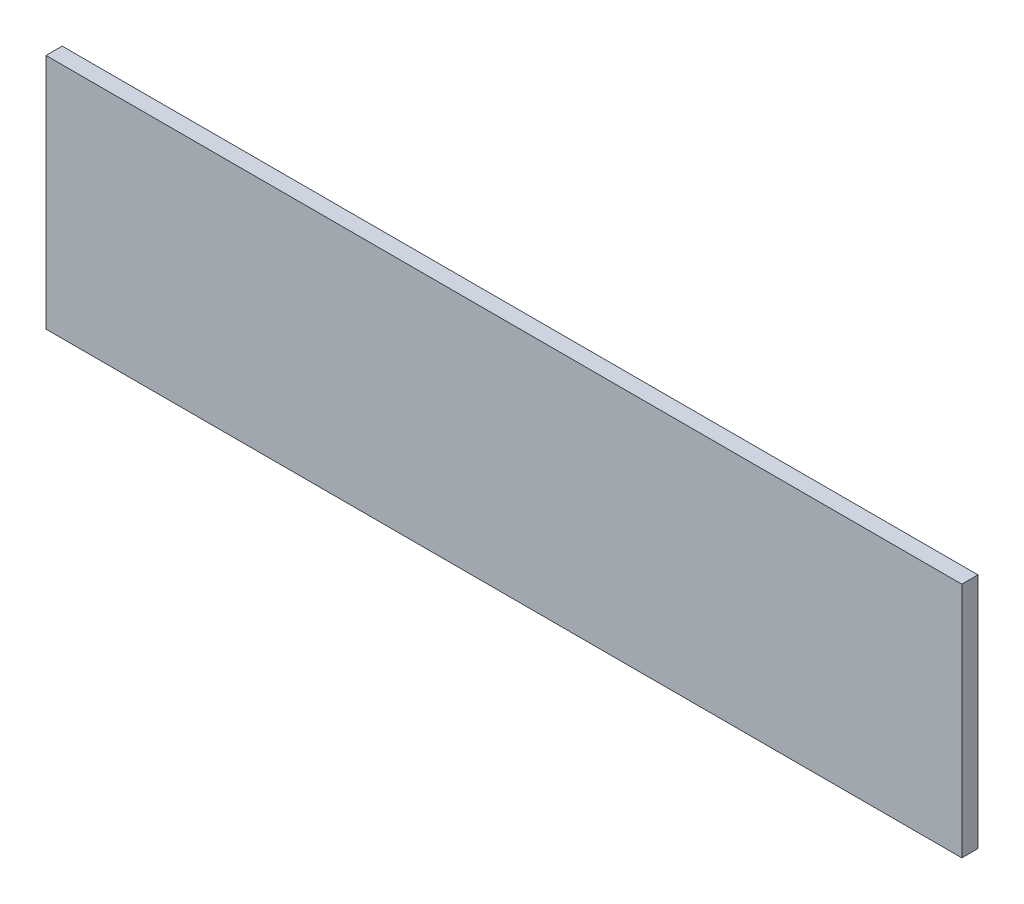
ISO-10303-21;
HEADER;
FILE_DESCRIPTION(('STEP AP214'),'2;1');
FILE_NAME('part.step','',(''),(''),'','','');
FILE_SCHEMA(('AUTOMOTIVE_DESIGN { 1 0 10303 214 1 1 1 1 }'));
ENDSEC;
DATA;
#1=APPLICATION_CONTEXT('core data for automotive mechanical design processes');
#2=APPLICATION_PROTOCOL_DEFINITION('international standard','automotive_design',2000,#1);
#3=PRODUCT_CONTEXT('',#1,'mechanical');
#4=PRODUCT('Part','Part','',(#3));
#5=PRODUCT_RELATED_PRODUCT_CATEGORY('part','',(#4));
#6=PRODUCT_DEFINITION_FORMATION('','',#4);
#7=PRODUCT_DEFINITION_CONTEXT('part definition',#1,'design');
#8=PRODUCT_DEFINITION('design','',#6,#7);
#9=PRODUCT_DEFINITION_SHAPE('','',#8);
#10=(LENGTH_UNIT() NAMED_UNIT(*) SI_UNIT(.MILLI.,.METRE.));
#11=(NAMED_UNIT(*) PLANE_ANGLE_UNIT() SI_UNIT($,.RADIAN.));
#12=(NAMED_UNIT(*) SI_UNIT($,.STERADIAN.) SOLID_ANGLE_UNIT());
#13=UNCERTAINTY_MEASURE_WITH_UNIT(LENGTH_MEASURE(1.E-05),#10,'distance_accuracy_value','');
#14=(GEOMETRIC_REPRESENTATION_CONTEXT(3) GLOBAL_UNCERTAINTY_ASSIGNED_CONTEXT((#13)) GLOBAL_UNIT_ASSIGNED_CONTEXT((#10,
#11,#12)) REPRESENTATION_CONTEXT('',''));
#15=CARTESIAN_POINT('',(0.,0.,0.));
#16=DIRECTION('',(0.,0.,1.));
#17=DIRECTION('',(1.,0.,0.));
#18=AXIS2_PLACEMENT_3D('',#15,#16,#17);
#19=CARTESIAN_POINT('',(0.,0.,3.));
#20=DIRECTION('',(1.,0.,0.));
#21=DIRECTION('',(0.,1.,0.));
#22=AXIS2_PLACEMENT_3D('',#19,#20,#21);
#23=PLANE('',#22);
#24=DIRECTION('',(0.,-1.,0.));
#25=VECTOR('',#24,1.);
#26=CARTESIAN_POINT('',(0.,0.,0.));
#27=LINE('',#26,#25);
#28=CARTESIAN_POINT('',(0.,0.,0.));
#29=VERTEX_POINT('',#28);
#30=CARTESIAN_POINT('',(0.,-44.,0.));
#31=VERTEX_POINT('',#30);
#32=EDGE_CURVE('E100',#29,#31,#27,.T.);
#33=ORIENTED_EDGE('',*,*,#32,.T.);
#34=DIRECTION('',(0.,0.,-1.));
#35=VECTOR('',#34,1.);
#36=CARTESIAN_POINT('',(0.,-44.,3.));
#37=LINE('',#36,#35);
#38=CARTESIAN_POINT('',(0.,-44.,3.));
#39=VERTEX_POINT('',#38);
#40=EDGE_CURVE('E11',#39,#31,#37,.T.);
#41=ORIENTED_EDGE('',*,*,#40,.F.);
#42=DIRECTION('',(0.,-1.,0.));
#43=VECTOR('',#42,1.);
#44=CARTESIAN_POINT('',(0.,0.,3.));
#45=LINE('',#44,#43);
#46=CARTESIAN_POINT('',(0.,0.,3.));
#47=VERTEX_POINT('',#46);
#48=EDGE_CURVE('E88',#47,#39,#45,.T.);
#49=ORIENTED_EDGE('',*,*,#48,.F.);
#50=DIRECTION('',(0.,0.,-1.));
#51=VECTOR('',#50,1.);
#52=CARTESIAN_POINT('',(0.,0.,3.));
#53=LINE('',#52,#51);
#54=EDGE_CURVE('E96',#47,#29,#53,.T.);
#55=ORIENTED_EDGE('',*,*,#54,.T.);
#56=EDGE_LOOP('',(#33,#41,#49,#55));
#57=FACE_BOUND('',#56,.T.);
#58=ADVANCED_FACE('F37',(#57),#23,.F.);
#59=CARTESIAN_POINT('',(0.,-44.,3.));
#60=DIRECTION('',(0.,1.,0.));
#61=DIRECTION('',(0.,0.,1.));
#62=AXIS2_PLACEMENT_3D('',#59,#60,#61);
#63=PLANE('',#62);
#64=DIRECTION('',(1.,0.,0.));
#65=VECTOR('',#64,1.);
#66=CARTESIAN_POINT('',(0.,-44.,0.));
#67=LINE('',#66,#65);
#68=CARTESIAN_POINT('',(170.,-44.,0.));
#69=VERTEX_POINT('',#68);
#70=EDGE_CURVE('E92',#31,#69,#67,.T.);
#71=ORIENTED_EDGE('',*,*,#70,.T.);
#72=DIRECTION('',(0.,0.,-1.));
#73=VECTOR('',#72,1.);
#74=CARTESIAN_POINT('',(170.,-44.,3.));
#75=LINE('',#74,#73);
#76=CARTESIAN_POINT('',(170.,-44.,3.));
#77=VERTEX_POINT('',#76);
#78=EDGE_CURVE('E45',#77,#69,#75,.T.);
#79=ORIENTED_EDGE('',*,*,#78,.F.);
#80=DIRECTION('',(1.,0.,0.));
#81=VECTOR('',#80,1.);
#82=CARTESIAN_POINT('',(0.,-44.,3.));
#83=LINE('',#82,#81);
#84=EDGE_CURVE('E83',#39,#77,#83,.T.);
#85=ORIENTED_EDGE('',*,*,#84,.F.);
#86=ORIENTED_EDGE('',*,*,#40,.T.);
#87=EDGE_LOOP('',(#71,#79,#85,#86));
#88=FACE_BOUND('',#87,.T.);
#89=ADVANCED_FACE('F91',(#88),#63,.F.);
#90=CARTESIAN_POINT('',(170.,0.,3.));
#91=DIRECTION('',(-1.,0.,0.));
#92=DIRECTION('',(0.,0.,1.));
#93=AXIS2_PLACEMENT_3D('',#90,#91,#92);
#94=PLANE('',#93);
#95=DIRECTION('',(0.,1.,0.));
#96=VECTOR('',#95,1.);
#97=CARTESIAN_POINT('',(170.,0.,0.));
#98=LINE('',#97,#96);
#99=CARTESIAN_POINT('',(170.,0.,0.));
#100=VERTEX_POINT('',#99);
#101=EDGE_CURVE('E70',#69,#100,#98,.T.);
#102=ORIENTED_EDGE('',*,*,#101,.T.);
#103=DIRECTION('',(0.,0.,-1.));
#104=VECTOR('',#103,1.);
#105=CARTESIAN_POINT('',(170.,0.,3.));
#106=LINE('',#105,#104);
#107=CARTESIAN_POINT('',(170.,0.,3.));
#108=VERTEX_POINT('',#107);
#109=EDGE_CURVE('E93',#108,#100,#106,.T.);
#110=ORIENTED_EDGE('',*,*,#109,.F.);
#111=DIRECTION('',(0.,1.,0.));
#112=VECTOR('',#111,1.);
#113=CARTESIAN_POINT('',(170.,0.,3.));
#114=LINE('',#113,#112);
#115=EDGE_CURVE('E86',#77,#108,#114,.T.);
#116=ORIENTED_EDGE('',*,*,#115,.F.);
#117=ORIENTED_EDGE('',*,*,#78,.T.);
#118=EDGE_LOOP('',(#102,#110,#116,#117));
#119=FACE_BOUND('',#118,.T.);
#120=ADVANCED_FACE('F94',(#119),#94,.F.);
#121=CARTESIAN_POINT('',(0.,0.,3.));
#122=DIRECTION('',(0.,-1.,0.));
#123=DIRECTION('',(0.,0.,-1.));
#124=AXIS2_PLACEMENT_3D('',#121,#122,#123);
#125=PLANE('',#124);
#126=DIRECTION('',(-1.,0.,0.));
#127=VECTOR('',#126,1.);
#128=CARTESIAN_POINT('',(0.,0.,0.));
#129=LINE('',#128,#127);
#130=EDGE_CURVE('E76',#100,#29,#129,.T.);
#131=ORIENTED_EDGE('',*,*,#130,.T.);
#132=ORIENTED_EDGE('',*,*,#54,.F.);
#133=DIRECTION('',(-1.,0.,0.));
#134=VECTOR('',#133,1.);
#135=CARTESIAN_POINT('',(0.,0.,3.));
#136=LINE('',#135,#134);
#137=EDGE_CURVE('E53',#108,#47,#136,.T.);
#138=ORIENTED_EDGE('',*,*,#137,.F.);
#139=ORIENTED_EDGE('',*,*,#109,.T.);
#140=EDGE_LOOP('',(#131,#132,#138,#139));
#141=FACE_BOUND('',#140,.T.);
#142=ADVANCED_FACE('F107',(#141),#125,.F.);
#143=CARTESIAN_POINT('',(0.,0.,3.));
#144=DIRECTION('',(0.,0.,1.));
#145=DIRECTION('',(1.,0.,0.));
#146=AXIS2_PLACEMENT_3D('',#143,#144,#145);
#147=PLANE('',#146);
#148=ORIENTED_EDGE('',*,*,#48,.T.);
#149=ORIENTED_EDGE('',*,*,#84,.T.);
#150=ORIENTED_EDGE('',*,*,#115,.T.);
#151=ORIENTED_EDGE('',*,*,#137,.T.);
#152=EDGE_LOOP('',(#148,#149,#150,#151));
#153=FACE_BOUND('',#152,.T.);
#154=ADVANCED_FACE('F84',(#153),#147,.T.);
#155=CARTESIAN_POINT('',(0.,0.,0.));
#156=DIRECTION('',(0.,0.,1.));
#157=DIRECTION('',(1.,0.,0.));
#158=AXIS2_PLACEMENT_3D('',#155,#156,#157);
#159=PLANE('',#158);
#160=ORIENTED_EDGE('',*,*,#32,.F.);
#161=ORIENTED_EDGE('',*,*,#130,.F.);
#162=ORIENTED_EDGE('',*,*,#101,.F.);
#163=ORIENTED_EDGE('',*,*,#70,.F.);
#164=EDGE_LOOP('',(#160,#161,#162,#163));
#165=FACE_BOUND('',#164,.T.);
#166=ADVANCED_FACE('F110',(#165),#159,.F.);
#167=CLOSED_SHELL('',(#58,#89,#120,#142,#154,#166));
#168=MANIFOLD_SOLID_BREP('B2',#167);
#169=ADVANCED_BREP_SHAPE_REPRESENTATION('',(#18,#168),#14);
#170=SHAPE_DEFINITION_REPRESENTATION(#9,#169);
ENDSEC;
END-ISO-10303-21;
